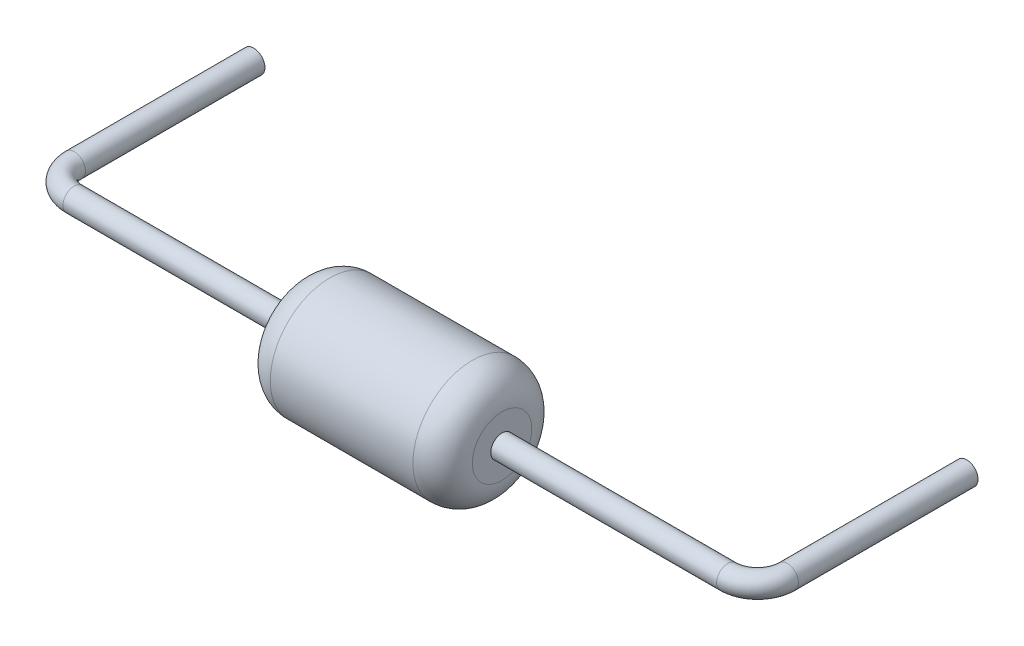
ISO-10303-21;
HEADER;
FILE_DESCRIPTION(('STEP AP214'),'2;1');
FILE_NAME('part.step','',(''),(''),'','','');
FILE_SCHEMA(('AUTOMOTIVE_DESIGN { 1 0 10303 214 1 1 1 1 }'));
ENDSEC;
DATA;
#1=APPLICATION_CONTEXT('core data for automotive mechanical design processes');
#2=APPLICATION_PROTOCOL_DEFINITION('international standard','automotive_design',2000,#1);
#3=PRODUCT_CONTEXT('',#1,'mechanical');
#4=PRODUCT('Part','Part','',(#3));
#5=PRODUCT_RELATED_PRODUCT_CATEGORY('part','',(#4));
#6=PRODUCT_DEFINITION_FORMATION('','',#4);
#7=PRODUCT_DEFINITION_CONTEXT('part definition',#1,'design');
#8=PRODUCT_DEFINITION('design','',#6,#7);
#9=PRODUCT_DEFINITION_SHAPE('','',#8);
#10=(LENGTH_UNIT() NAMED_UNIT(*) SI_UNIT(.MILLI.,.METRE.));
#11=(NAMED_UNIT(*) PLANE_ANGLE_UNIT() SI_UNIT($,.RADIAN.));
#12=(NAMED_UNIT(*) SI_UNIT($,.STERADIAN.) SOLID_ANGLE_UNIT());
#13=UNCERTAINTY_MEASURE_WITH_UNIT(LENGTH_MEASURE(1.E-05),#10,'distance_accuracy_value','');
#14=(GEOMETRIC_REPRESENTATION_CONTEXT(3) GLOBAL_UNCERTAINTY_ASSIGNED_CONTEXT((#13)) GLOBAL_UNIT_ASSIGNED_CONTEXT((#10,
#11,#12)) REPRESENTATION_CONTEXT('',''));
#15=CARTESIAN_POINT('',(0.,0.,0.));
#16=DIRECTION('',(0.,0.,1.));
#17=DIRECTION('',(1.,0.,0.));
#18=AXIS2_PLACEMENT_3D('',#15,#16,#17);
#19=CARTESIAN_POINT('',(51.8137110474384,69.72049302,0.6731));
#20=DIRECTION('',(0.,-1.,0.));
#21=DIRECTION('',(0.,0.,-1.));
#22=AXIS2_PLACEMENT_3D('',#19,#20,#21);
#23=TOROIDAL_SURFACE('',#22,0.635,0.2413);
#24=CARTESIAN_POINT('',(52.4487110474384,69.72049302,0.6731));
#25=DIRECTION('',(0.,0.,-1.));
#26=DIRECTION('',(-1.,0.,0.));
#27=AXIS2_PLACEMENT_3D('',#24,#25,#26);
#28=CIRCLE('',#27,0.2413);
#29=CARTESIAN_POINT('',(52.2074110474384,69.72049302,0.6731));
#30=VERTEX_POINT('',#29);
#31=EDGE_CURVE('E40',#30,#30,#28,.T.);
#32=ORIENTED_EDGE('',*,*,#31,.F.);
#33=EDGE_LOOP('',(#32));
#34=FACE_BOUND('',#33,.T.);
#35=CARTESIAN_POINT('',(51.8137110474384,69.72049302,1.3081));
#36=DIRECTION('',(1.,0.,0.));
#37=DIRECTION('',(0.,0.,-1.));
#38=AXIS2_PLACEMENT_3D('',#35,#36,#37);
#39=CIRCLE('',#38,0.2413);
#40=CARTESIAN_POINT('',(51.8137110474384,69.72049302,1.0668));
#41=VERTEX_POINT('',#40);
#42=EDGE_CURVE('E11',#41,#41,#39,.T.);
#43=ORIENTED_EDGE('',*,*,#42,.T.);
#44=EDGE_LOOP('',(#43));
#45=FACE_BOUND('',#44,.T.);
#46=ADVANCED_FACE('F16',(#34,#45),#23,.T.);
#47=CARTESIAN_POINT('',(37.8437110474384,69.72049302,0.6731));
#48=DIRECTION('',(0.,-1.,0.));
#49=DIRECTION('',(0.,0.,-1.));
#50=AXIS2_PLACEMENT_3D('',#47,#48,#49);
#51=TOROIDAL_SURFACE('',#50,0.635,0.2413);
#52=CARTESIAN_POINT('',(37.8437110474384,69.72049302,1.3081));
#53=DIRECTION('',(1.,0.,0.));
#54=DIRECTION('',(0.,0.,-1.));
#55=AXIS2_PLACEMENT_3D('',#52,#53,#54);
#56=CIRCLE('',#55,0.2413);
#57=CARTESIAN_POINT('',(37.8437110474384,69.72049302,1.0668));
#58=VERTEX_POINT('',#57);
#59=EDGE_CURVE('E115',#58,#58,#56,.T.);
#60=ORIENTED_EDGE('',*,*,#59,.F.);
#61=EDGE_LOOP('',(#60));
#62=FACE_BOUND('',#61,.T.);
#63=CARTESIAN_POINT('',(37.2087110474384,69.72049302,0.6731));
#64=DIRECTION('',(0.,0.,1.));
#65=DIRECTION('',(1.,0.,0.));
#66=AXIS2_PLACEMENT_3D('',#63,#64,#65);
#67=CIRCLE('',#66,0.2413);
#68=CARTESIAN_POINT('',(37.4500110474384,69.72049302,0.6731));
#69=VERTEX_POINT('',#68);
#70=EDGE_CURVE('E27',#69,#69,#67,.T.);
#71=ORIENTED_EDGE('',*,*,#70,.T.);
#72=EDGE_LOOP('',(#71));
#73=FACE_BOUND('',#72,.T.);
#74=ADVANCED_FACE('F154',(#62,#73),#51,.T.);
#75=CARTESIAN_POINT('',(37.2087110474384,69.72049302,0.0127000000000011));
#76=DIRECTION('',(0.,0.,-1.));
#77=DIRECTION('',(-1.,0.,0.));
#78=AXIS2_PLACEMENT_3D('',#75,#76,#77);
#79=CYLINDRICAL_SURFACE('',#78,0.2413);
#80=ORIENTED_EDGE('',*,*,#70,.F.);
#81=EDGE_LOOP('',(#80));
#82=FACE_BOUND('',#81,.T.);
#83=CARTESIAN_POINT('',(37.2087110474384,69.72049302,-3.1623));
#84=DIRECTION('',(0.,0.,1.));
#85=DIRECTION('',(-1.,0.,0.));
#86=AXIS2_PLACEMENT_3D('',#83,#84,#85);
#87=CIRCLE('',#86,0.2413);
#88=CARTESIAN_POINT('',(36.9674110474384,69.72049302,-3.1623));
#89=VERTEX_POINT('',#88);
#90=EDGE_CURVE('E120',#89,#89,#87,.T.);
#91=ORIENTED_EDGE('',*,*,#90,.T.);
#92=EDGE_LOOP('',(#91));
#93=FACE_BOUND('',#92,.T.);
#94=ADVANCED_FACE('F157',(#82,#93),#79,.T.);
#95=CARTESIAN_POINT('',(52.4487110474384,69.72049302,0.0127000000000011));
#96=DIRECTION('',(0.,0.,-1.));
#97=DIRECTION('',(-1.,0.,0.));
#98=AXIS2_PLACEMENT_3D('',#95,#96,#97);
#99=CYLINDRICAL_SURFACE('',#98,0.2413);
#100=ORIENTED_EDGE('',*,*,#31,.T.);
#101=EDGE_LOOP('',(#100));
#102=FACE_BOUND('',#101,.T.);
#103=CARTESIAN_POINT('',(52.4487110474384,69.72049302,-3.1623));
#104=DIRECTION('',(0.,0.,1.));
#105=DIRECTION('',(-1.,0.,0.));
#106=AXIS2_PLACEMENT_3D('',#103,#104,#105);
#107=CIRCLE('',#106,0.2413);
#108=CARTESIAN_POINT('',(52.2074110474384,69.72049302,-3.1623));
#109=VERTEX_POINT('',#108);
#110=EDGE_CURVE('E20',#109,#109,#107,.T.);
#111=ORIENTED_EDGE('',*,*,#110,.T.);
#112=EDGE_LOOP('',(#111));
#113=FACE_BOUND('',#112,.T.);
#114=ADVANCED_FACE('F162',(#102,#113),#99,.T.);
#115=CARTESIAN_POINT('',(51.8137110474384,69.72049302,1.3081));
#116=DIRECTION('',(-1.,0.,0.));
#117=DIRECTION('',(0.,0.,-1.));
#118=AXIS2_PLACEMENT_3D('',#115,#116,#117);
#119=CYLINDRICAL_SURFACE('',#118,0.2413);
#120=ORIENTED_EDGE('',*,*,#42,.F.);
#121=EDGE_LOOP('',(#120));
#122=FACE_BOUND('',#121,.T.);
#123=CARTESIAN_POINT('',(46.9877110474384,69.72049302,1.3081));
#124=DIRECTION('',(1.,0.,0.));
#125=DIRECTION('',(0.,0.,-1.));
#126=AXIS2_PLACEMENT_3D('',#123,#124,#125);
#127=CIRCLE('',#126,0.2413);
#128=CARTESIAN_POINT('',(46.9877110474384,69.72049302,1.0668));
#129=VERTEX_POINT('',#128);
#130=EDGE_CURVE('E103',#129,#129,#127,.T.);
#131=ORIENTED_EDGE('',*,*,#130,.T.);
#132=EDGE_LOOP('',(#131));
#133=FACE_BOUND('',#132,.T.);
#134=ADVANCED_FACE('F151',(#122,#133),#119,.T.);
#135=CARTESIAN_POINT('',(51.8137110474384,69.72049302,1.3081));
#136=DIRECTION('',(-1.,0.,0.));
#137=DIRECTION('',(0.,0.,-1.));
#138=AXIS2_PLACEMENT_3D('',#135,#136,#137);
#139=CYLINDRICAL_SURFACE('',#138,0.2413);
#140=CARTESIAN_POINT('',(42.6697110474384,69.72049302,1.3081));
#141=DIRECTION('',(-1.,0.,0.));
#142=DIRECTION('',(0.,0.,-1.));
#143=AXIS2_PLACEMENT_3D('',#140,#141,#142);
#144=CIRCLE('',#143,0.2413);
#145=CARTESIAN_POINT('',(42.6697110474384,69.72049302,1.5494));
#146=VERTEX_POINT('',#145);
#147=EDGE_CURVE('E107',#146,#146,#144,.T.);
#148=ORIENTED_EDGE('',*,*,#147,.T.);
#149=EDGE_LOOP('',(#148));
#150=FACE_BOUND('',#149,.T.);
#151=ORIENTED_EDGE('',*,*,#59,.T.);
#152=EDGE_LOOP('',(#151));
#153=FACE_BOUND('',#152,.T.);
#154=ADVANCED_FACE('F147',(#150,#153),#139,.T.);
#155=CARTESIAN_POINT('',(43.3047110474384,69.72049302,1.3081));
#156=DIRECTION('',(-1.,0.,0.));
#157=DIRECTION('',(0.,0.,1.));
#158=AXIS2_PLACEMENT_3D('',#155,#156,#157);
#159=DEGENERATE_TOROIDAL_SURFACE('',#158,0.635,0.635,.T.);
#160=CARTESIAN_POINT('',(43.3047110474384,69.72049302,1.3081));
#161=DIRECTION('',(-1.,0.,0.));
#162=DIRECTION('',(0.,0.,1.));
#163=AXIS2_PLACEMENT_3D('',#160,#161,#162);
#164=CIRCLE('',#163,1.27);
#165=CARTESIAN_POINT('',(43.3047110474384,69.72049302,0.0381000000000012));
#166=VERTEX_POINT('',#165);
#167=EDGE_CURVE('E68',#166,#166,#164,.T.);
#168=ORIENTED_EDGE('',*,*,#167,.T.);
#169=EDGE_LOOP('',(#168));
#170=FACE_BOUND('',#169,.T.);
#171=CARTESIAN_POINT('',(42.6697110474384,69.72049302,1.3081));
#172=DIRECTION('',(-1.,0.,0.));
#173=DIRECTION('',(0.,0.,1.));
#174=AXIS2_PLACEMENT_3D('',#171,#172,#173);
#175=CIRCLE('',#174,0.635);
#176=CARTESIAN_POINT('',(42.6697110474384,69.72049302,1.9431));
#177=VERTEX_POINT('',#176);
#178=EDGE_CURVE('E76',#177,#177,#175,.T.);
#179=ORIENTED_EDGE('',*,*,#178,.F.);
#180=EDGE_LOOP('',(#179));
#181=FACE_BOUND('',#180,.T.);
#182=ADVANCED_FACE('F150',(#170,#181),#159,.T.);
#183=CARTESIAN_POINT('',(44.8287110474384,69.72049302,1.3081));
#184=DIRECTION('',(-1.,0.,0.));
#185=DIRECTION('',(0.,0.,1.));
#186=AXIS2_PLACEMENT_3D('',#183,#184,#185);
#187=CYLINDRICAL_SURFACE('',#186,1.27);
#188=CARTESIAN_POINT('',(46.3527110474384,69.72049302,1.3081));
#189=DIRECTION('',(-1.,0.,0.));
#190=DIRECTION('',(0.,0.,1.));
#191=AXIS2_PLACEMENT_3D('',#188,#189,#190);
#192=CIRCLE('',#191,1.27);
#193=CARTESIAN_POINT('',(46.3527110474384,69.72049302,0.0381000000000016));
#194=VERTEX_POINT('',#193);
#195=EDGE_CURVE('E86',#194,#194,#192,.T.);
#196=ORIENTED_EDGE('',*,*,#195,.T.);
#197=EDGE_LOOP('',(#196));
#198=FACE_BOUND('',#197,.T.);
#199=ORIENTED_EDGE('',*,*,#167,.F.);
#200=EDGE_LOOP('',(#199));
#201=FACE_BOUND('',#200,.T.);
#202=ADVANCED_FACE('F179',(#198,#201),#187,.T.);
#203=CARTESIAN_POINT('',(46.3527110474384,69.72049302,1.3081));
#204=DIRECTION('',(-1.,0.,0.));
#205=DIRECTION('',(0.,0.,1.));
#206=AXIS2_PLACEMENT_3D('',#203,#204,#205);
#207=DEGENERATE_TOROIDAL_SURFACE('',#206,0.635,0.635,.T.);
#208=CARTESIAN_POINT('',(46.9877110474384,69.72049302,1.3081));
#209=DIRECTION('',(-1.,0.,0.));
#210=DIRECTION('',(0.,0.,1.));
#211=AXIS2_PLACEMENT_3D('',#208,#209,#210);
#212=CIRCLE('',#211,0.635);
#213=CARTESIAN_POINT('',(46.9877110474384,69.72049302,0.6731));
#214=VERTEX_POINT('',#213);
#215=EDGE_CURVE('E125',#214,#214,#212,.T.);
#216=ORIENTED_EDGE('',*,*,#215,.T.);
#217=EDGE_LOOP('',(#216));
#218=FACE_BOUND('',#217,.T.);
#219=ORIENTED_EDGE('',*,*,#195,.F.);
#220=EDGE_LOOP('',(#219));
#221=FACE_BOUND('',#220,.T.);
#222=ADVANCED_FACE('F177',(#218,#221),#207,.T.);
#223=CARTESIAN_POINT('',(46.9877110474384,69.72049302,1.6256));
#224=DIRECTION('',(1.,0.,0.));
#225=DIRECTION('',(0.,1.,0.));
#226=AXIS2_PLACEMENT_3D('',#223,#224,#225);
#227=PLANE('',#226);
#228=ORIENTED_EDGE('',*,*,#215,.F.);
#229=EDGE_LOOP('',(#228));
#230=FACE_BOUND('',#229,.T.);
#231=ORIENTED_EDGE('',*,*,#130,.F.);
#232=EDGE_LOOP('',(#231));
#233=FACE_BOUND('',#232,.T.);
#234=ADVANCED_FACE('F104',(#230,#233),#227,.T.);
#235=CARTESIAN_POINT('',(42.6697110474384,69.72049302,1.6256));
#236=DIRECTION('',(-1.,0.,0.));
#237=DIRECTION('',(0.,0.,1.));
#238=AXIS2_PLACEMENT_3D('',#235,#236,#237);
#239=PLANE('',#238);
#240=ORIENTED_EDGE('',*,*,#178,.T.);
#241=EDGE_LOOP('',(#240));
#242=FACE_BOUND('',#241,.T.);
#243=ORIENTED_EDGE('',*,*,#147,.F.);
#244=EDGE_LOOP('',(#243));
#245=FACE_BOUND('',#244,.T.);
#246=ADVANCED_FACE('F142',(#242,#245),#239,.T.);
#247=CARTESIAN_POINT('',(52.4487110474384,69.72049302,-3.1623));
#248=DIRECTION('',(0.,0.,-1.));
#249=DIRECTION('',(0.,-1.,0.));
#250=AXIS2_PLACEMENT_3D('',#247,#248,#249);
#251=PLANE('',#250);
#252=ORIENTED_EDGE('',*,*,#110,.F.);
#253=EDGE_LOOP('',(#252));
#254=FACE_BOUND('',#253,.T.);
#255=ADVANCED_FACE('F18',(#254),#251,.T.);
#256=CARTESIAN_POINT('',(37.2087110474384,69.72049302,-3.1623));
#257=DIRECTION('',(0.,0.,-1.));
#258=DIRECTION('',(0.,-1.,0.));
#259=AXIS2_PLACEMENT_3D('',#256,#257,#258);
#260=PLANE('',#259);
#261=ORIENTED_EDGE('',*,*,#90,.F.);
#262=EDGE_LOOP('',(#261));
#263=FACE_BOUND('',#262,.T.);
#264=ADVANCED_FACE('F165',(#263),#260,.T.);
#265=CLOSED_SHELL('',(#46,#74,#94,#114,#134,#154,#182,#202,#222,#234,#246,#255,#264));
#266=MANIFOLD_SOLID_BREP('B1',#265);
#267=ADVANCED_BREP_SHAPE_REPRESENTATION('',(#18,#266),#14);
#268=SHAPE_DEFINITION_REPRESENTATION(#9,#267);
ENDSEC;
END-ISO-10303-21;
